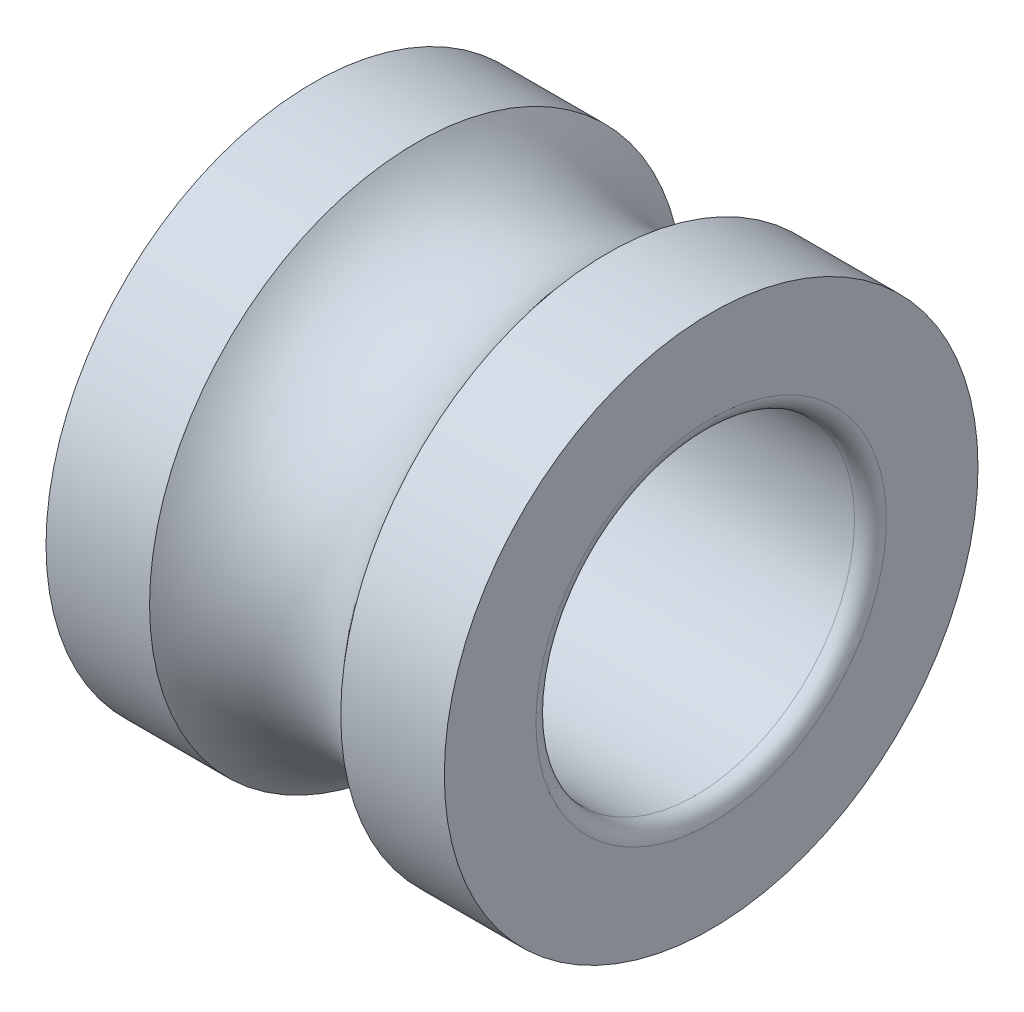
ISO-10303-21;
HEADER;
FILE_DESCRIPTION(('STEP AP214'),'2;1');
FILE_NAME('part.step','',(''),(''),'','','');
FILE_SCHEMA(('AUTOMOTIVE_DESIGN { 1 0 10303 214 1 1 1 1 }'));
ENDSEC;
DATA;
#1=APPLICATION_CONTEXT('core data for automotive mechanical design processes');
#2=APPLICATION_PROTOCOL_DEFINITION('international standard','automotive_design',2000,#1);
#3=PRODUCT_CONTEXT('',#1,'mechanical');
#4=PRODUCT('Part','Part','',(#3));
#5=PRODUCT_RELATED_PRODUCT_CATEGORY('part','',(#4));
#6=PRODUCT_DEFINITION_FORMATION('','',#4);
#7=PRODUCT_DEFINITION_CONTEXT('part definition',#1,'design');
#8=PRODUCT_DEFINITION('design','',#6,#7);
#9=PRODUCT_DEFINITION_SHAPE('','',#8);
#10=(LENGTH_UNIT() NAMED_UNIT(*) SI_UNIT(.MILLI.,.METRE.));
#11=(NAMED_UNIT(*) PLANE_ANGLE_UNIT() SI_UNIT($,.RADIAN.));
#12=(NAMED_UNIT(*) SI_UNIT($,.STERADIAN.) SOLID_ANGLE_UNIT());
#13=UNCERTAINTY_MEASURE_WITH_UNIT(LENGTH_MEASURE(1.E-05),#10,'distance_accuracy_value','');
#14=(GEOMETRIC_REPRESENTATION_CONTEXT(3) GLOBAL_UNCERTAINTY_ASSIGNED_CONTEXT((#13)) GLOBAL_UNIT_ASSIGNED_CONTEXT((#10,
#11,#12)) REPRESENTATION_CONTEXT('',''));
#15=CARTESIAN_POINT('',(0.,0.,0.));
#16=DIRECTION('',(0.,0.,1.));
#17=DIRECTION('',(1.,0.,0.));
#18=AXIS2_PLACEMENT_3D('',#15,#16,#17);
#19=CARTESIAN_POINT('',(0.,0.,0.));
#20=DIRECTION('',(-1.,0.,0.));
#21=DIRECTION('',(0.,0.,1.));
#22=AXIS2_PLACEMENT_3D('',#19,#20,#21);
#23=CYLINDRICAL_SURFACE('',#22,3.35);
#24=CARTESIAN_POINT('',(0.,0.,0.));
#25=DIRECTION('',(-1.,0.,0.));
#26=DIRECTION('',(0.,0.,1.));
#27=AXIS2_PLACEMENT_3D('',#24,#25,#26);
#28=CIRCLE('',#27,3.35);
#29=CARTESIAN_POINT('',(0.,0.,3.35));
#30=VERTEX_POINT('',#29);
#31=EDGE_CURVE('E10',#30,#30,#28,.T.);
#32=ORIENTED_EDGE('',*,*,#31,.F.);
#33=EDGE_LOOP('',(#32));
#34=FACE_BOUND('',#33,.T.);
#35=CARTESIAN_POINT('',(1.3,0.,0.));
#36=DIRECTION('',(-1.,0.,0.));
#37=DIRECTION('',(0.,0.,1.));
#38=AXIS2_PLACEMENT_3D('',#35,#36,#37);
#39=CIRCLE('',#38,3.35);
#40=CARTESIAN_POINT('',(1.3,0.,3.35));
#41=VERTEX_POINT('',#40);
#42=EDGE_CURVE('E56',#41,#41,#39,.T.);
#43=ORIENTED_EDGE('',*,*,#42,.T.);
#44=EDGE_LOOP('',(#43));
#45=FACE_BOUND('',#44,.T.);
#46=ADVANCED_FACE('F14',(#34,#45),#23,.T.);
#47=CARTESIAN_POINT('',(0.,3.35,0.));
#48=DIRECTION('',(1.,0.,0.));
#49=DIRECTION('',(0.,0.,-1.));
#50=AXIS2_PLACEMENT_3D('',#47,#48,#49);
#51=PLANE('',#50);
#52=CARTESIAN_POINT('',(0.,0.,0.));
#53=DIRECTION('',(-1.,0.,0.));
#54=DIRECTION('',(0.,0.,1.));
#55=AXIS2_PLACEMENT_3D('',#52,#53,#54);
#56=CIRCLE('',#55,2.2);
#57=CARTESIAN_POINT('',(0.,0.,2.2));
#58=VERTEX_POINT('',#57);
#59=EDGE_CURVE('E21',#58,#58,#56,.T.);
#60=ORIENTED_EDGE('',*,*,#59,.F.);
#61=EDGE_LOOP('',(#60));
#62=FACE_BOUND('',#61,.T.);
#63=ORIENTED_EDGE('',*,*,#31,.T.);
#64=EDGE_LOOP('',(#63));
#65=FACE_BOUND('',#64,.T.);
#66=ADVANCED_FACE('F75',(#62,#65),#51,.F.);
#67=CARTESIAN_POINT('',(0.2,0.,0.));
#68=DIRECTION('',(-1.,0.,0.));
#69=DIRECTION('',(0.,0.,1.));
#70=AXIS2_PLACEMENT_3D('',#67,#68,#69);
#71=TOROIDAL_SURFACE('',#70,2.2,0.2);
#72=CARTESIAN_POINT('',(0.2,0.,0.));
#73=DIRECTION('',(-1.,0.,0.));
#74=DIRECTION('',(0.,0.,1.));
#75=AXIS2_PLACEMENT_3D('',#72,#73,#74);
#76=CIRCLE('',#75,2.);
#77=CARTESIAN_POINT('',(0.2,0.,2.));
#78=VERTEX_POINT('',#77);
#79=EDGE_CURVE('E30',#78,#78,#76,.T.);
#80=ORIENTED_EDGE('',*,*,#79,.F.);
#81=EDGE_LOOP('',(#80));
#82=FACE_BOUND('',#81,.T.);
#83=ORIENTED_EDGE('',*,*,#59,.T.);
#84=EDGE_LOOP('',(#83));
#85=FACE_BOUND('',#84,.T.);
#86=ADVANCED_FACE('F80',(#82,#85),#71,.T.);
#87=CARTESIAN_POINT('',(0.,0.,0.));
#88=DIRECTION('',(-1.,0.,0.));
#89=DIRECTION('',(0.,0.,1.));
#90=AXIS2_PLACEMENT_3D('',#87,#88,#89);
#91=CYLINDRICAL_SURFACE('',#90,2.);
#92=CARTESIAN_POINT('',(4.8,0.,0.));
#93=DIRECTION('',(-1.,0.,0.));
#94=DIRECTION('',(0.,0.,1.));
#95=AXIS2_PLACEMENT_3D('',#92,#93,#94);
#96=CIRCLE('',#95,2.);
#97=CARTESIAN_POINT('',(4.8,0.,2.));
#98=VERTEX_POINT('',#97);
#99=EDGE_CURVE('E38',#98,#98,#96,.T.);
#100=ORIENTED_EDGE('',*,*,#99,.F.);
#101=EDGE_LOOP('',(#100));
#102=FACE_BOUND('',#101,.T.);
#103=ORIENTED_EDGE('',*,*,#79,.T.);
#104=EDGE_LOOP('',(#103));
#105=FACE_BOUND('',#104,.T.);
#106=ADVANCED_FACE('F85',(#102,#105),#91,.F.);
#107=CARTESIAN_POINT('',(4.8,0.,0.));
#108=DIRECTION('',(-1.,0.,0.));
#109=DIRECTION('',(0.,0.,1.));
#110=AXIS2_PLACEMENT_3D('',#107,#108,#109);
#111=TOROIDAL_SURFACE('',#110,2.2,0.2);
#112=CARTESIAN_POINT('',(5.,0.,0.));
#113=DIRECTION('',(-1.,0.,0.));
#114=DIRECTION('',(0.,0.,1.));
#115=AXIS2_PLACEMENT_3D('',#112,#113,#114);
#116=CIRCLE('',#115,2.2);
#117=CARTESIAN_POINT('',(5.,0.,2.2));
#118=VERTEX_POINT('',#117);
#119=EDGE_CURVE('E44',#118,#118,#116,.T.);
#120=ORIENTED_EDGE('',*,*,#119,.F.);
#121=EDGE_LOOP('',(#120));
#122=FACE_BOUND('',#121,.T.);
#123=ORIENTED_EDGE('',*,*,#99,.T.);
#124=EDGE_LOOP('',(#123));
#125=FACE_BOUND('',#124,.T.);
#126=ADVANCED_FACE('F91',(#122,#125),#111,.T.);
#127=CARTESIAN_POINT('',(5.,2.2,0.));
#128=DIRECTION('',(-1.,0.,0.));
#129=DIRECTION('',(0.,0.,1.));
#130=AXIS2_PLACEMENT_3D('',#127,#128,#129);
#131=PLANE('',#130);
#132=CARTESIAN_POINT('',(5.,0.,0.));
#133=DIRECTION('',(-1.,0.,0.));
#134=DIRECTION('',(0.,0.,1.));
#135=AXIS2_PLACEMENT_3D('',#132,#133,#134);
#136=CIRCLE('',#135,3.35);
#137=CARTESIAN_POINT('',(5.,0.,3.35));
#138=VERTEX_POINT('',#137);
#139=EDGE_CURVE('E48',#138,#138,#136,.T.);
#140=ORIENTED_EDGE('',*,*,#139,.F.);
#141=EDGE_LOOP('',(#140));
#142=FACE_BOUND('',#141,.T.);
#143=ORIENTED_EDGE('',*,*,#119,.T.);
#144=EDGE_LOOP('',(#143));
#145=FACE_BOUND('',#144,.T.);
#146=ADVANCED_FACE('F71',(#142,#145),#131,.F.);
#147=CARTESIAN_POINT('',(0.,0.,0.));
#148=DIRECTION('',(-1.,0.,0.));
#149=DIRECTION('',(0.,0.,1.));
#150=AXIS2_PLACEMENT_3D('',#147,#148,#149);
#151=CYLINDRICAL_SURFACE('',#150,3.35);
#152=CARTESIAN_POINT('',(3.7,0.,0.));
#153=DIRECTION('',(-1.,0.,0.));
#154=DIRECTION('',(0.,0.,1.));
#155=AXIS2_PLACEMENT_3D('',#152,#153,#154);
#156=CIRCLE('',#155,3.35);
#157=CARTESIAN_POINT('',(3.7,0.,3.35));
#158=VERTEX_POINT('',#157);
#159=EDGE_CURVE('E52',#158,#158,#156,.T.);
#160=ORIENTED_EDGE('',*,*,#159,.F.);
#161=EDGE_LOOP('',(#160));
#162=FACE_BOUND('',#161,.T.);
#163=ORIENTED_EDGE('',*,*,#139,.T.);
#164=EDGE_LOOP('',(#163));
#165=FACE_BOUND('',#164,.T.);
#166=ADVANCED_FACE('F64',(#162,#165),#151,.T.);
#167=CARTESIAN_POINT('',(2.5,0.,0.));
#168=DIRECTION('',(-1.,0.,0.));
#169=DIRECTION('',(0.,0.,1.));
#170=AXIS2_PLACEMENT_3D('',#167,#168,#169);
#171=TOROIDAL_SURFACE('',#170,4.25,1.5);
#172=ORIENTED_EDGE('',*,*,#159,.T.);
#173=EDGE_LOOP('',(#172));
#174=FACE_BOUND('',#173,.T.);
#175=ORIENTED_EDGE('',*,*,#42,.F.);
#176=EDGE_LOOP('',(#175));
#177=FACE_BOUND('',#176,.T.);
#178=ADVANCED_FACE('F62',(#174,#177),#171,.F.);
#179=CLOSED_SHELL('',(#46,#66,#86,#106,#126,#146,#166,#178));
#180=MANIFOLD_SOLID_BREP('B1',#179);
#181=ADVANCED_BREP_SHAPE_REPRESENTATION('',(#18,#180),#14);
#182=SHAPE_DEFINITION_REPRESENTATION(#9,#181);
ENDSEC;
END-ISO-10303-21;
